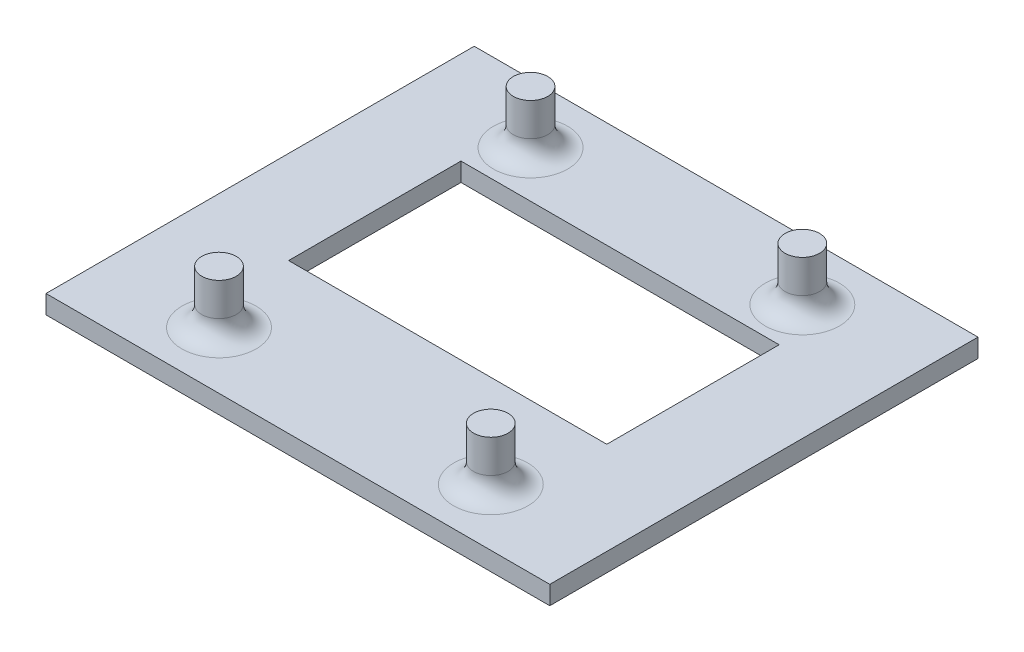
ISO-10303-21;
HEADER;
FILE_DESCRIPTION(('STEP AP214'),'2;1');
FILE_NAME('part.step','',(''),(''),'','','');
FILE_SCHEMA(('AUTOMOTIVE_DESIGN { 1 0 10303 214 1 1 1 1 }'));
ENDSEC;
DATA;
#1=APPLICATION_CONTEXT('core data for automotive mechanical design processes');
#2=APPLICATION_PROTOCOL_DEFINITION('international standard','automotive_design',2000,#1);
#3=PRODUCT_CONTEXT('',#1,'mechanical');
#4=PRODUCT('Part','Part','',(#3));
#5=PRODUCT_RELATED_PRODUCT_CATEGORY('part','',(#4));
#6=PRODUCT_DEFINITION_FORMATION('','',#4);
#7=PRODUCT_DEFINITION_CONTEXT('part definition',#1,'design');
#8=PRODUCT_DEFINITION('design','',#6,#7);
#9=PRODUCT_DEFINITION_SHAPE('','',#8);
#10=(LENGTH_UNIT() NAMED_UNIT(*) SI_UNIT(.MILLI.,.METRE.));
#11=(NAMED_UNIT(*) PLANE_ANGLE_UNIT() SI_UNIT($,.RADIAN.));
#12=(NAMED_UNIT(*) SI_UNIT($,.STERADIAN.) SOLID_ANGLE_UNIT());
#13=UNCERTAINTY_MEASURE_WITH_UNIT(LENGTH_MEASURE(1.E-05),#10,'distance_accuracy_value','');
#14=(GEOMETRIC_REPRESENTATION_CONTEXT(3) GLOBAL_UNCERTAINTY_ASSIGNED_CONTEXT((#13)) GLOBAL_UNIT_ASSIGNED_CONTEXT((#10,
#11,#12)) REPRESENTATION_CONTEXT('',''));
#15=CARTESIAN_POINT('',(0.,0.,0.));
#16=DIRECTION('',(0.,0.,1.));
#17=DIRECTION('',(1.,0.,0.));
#18=AXIS2_PLACEMENT_3D('',#15,#16,#17);
#19=CARTESIAN_POINT('',(0.,1.4,0.));
#20=DIRECTION('',(0.,1.,0.));
#21=DIRECTION('',(0.,0.,1.));
#22=AXIS2_PLACEMENT_3D('',#19,#20,#21);
#23=PLANE('',#22);
#24=CARTESIAN_POINT('',(-10.25,1.4,13.5));
#25=DIRECTION('',(0.,1.,0.));
#26=DIRECTION('',(0.,0.,1.));
#27=AXIS2_PLACEMENT_3D('',#24,#25,#26);
#28=CIRCLE('',#27,2.8);
#29=CARTESIAN_POINT('',(-10.25,1.4,16.3));
#30=VERTEX_POINT('',#29);
#31=EDGE_CURVE('E215',#30,#30,#28,.F.);
#32=ORIENTED_EDGE('',*,*,#31,.T.);
#33=EDGE_LOOP('',(#32));
#34=FACE_BOUND('',#33,.T.);
#35=CARTESIAN_POINT('',(10.25,1.4,13.5));
#36=DIRECTION('',(0.,1.,0.));
#37=DIRECTION('',(0.,0.,1.));
#38=AXIS2_PLACEMENT_3D('',#35,#36,#37);
#39=CIRCLE('',#38,2.8);
#40=CARTESIAN_POINT('',(10.25,1.4,16.3));
#41=VERTEX_POINT('',#40);
#42=EDGE_CURVE('E211',#41,#41,#39,.F.);
#43=ORIENTED_EDGE('',*,*,#42,.T.);
#44=EDGE_LOOP('',(#43));
#45=FACE_BOUND('',#44,.T.);
#46=CARTESIAN_POINT('',(10.25,1.4,-10.));
#47=DIRECTION('',(0.,1.,0.));
#48=DIRECTION('',(0.,0.,1.));
#49=AXIS2_PLACEMENT_3D('',#46,#47,#48);
#50=CIRCLE('',#49,2.8);
#51=CARTESIAN_POINT('',(10.25,1.4,-7.2));
#52=VERTEX_POINT('',#51);
#53=EDGE_CURVE('E207',#52,#52,#50,.F.);
#54=ORIENTED_EDGE('',*,*,#53,.T.);
#55=EDGE_LOOP('',(#54));
#56=FACE_BOUND('',#55,.T.);
#57=CARTESIAN_POINT('',(-10.25,1.4,-10.));
#58=DIRECTION('',(0.,1.,0.));
#59=DIRECTION('',(0.,0.,1.));
#60=AXIS2_PLACEMENT_3D('',#57,#58,#59);
#61=CIRCLE('',#60,2.8);
#62=CARTESIAN_POINT('',(-10.25,1.4,-7.2));
#63=VERTEX_POINT('',#62);
#64=EDGE_CURVE('E203',#63,#63,#61,.F.);
#65=ORIENTED_EDGE('',*,*,#64,.T.);
#66=EDGE_LOOP('',(#65));
#67=FACE_BOUND('',#66,.T.);
#68=DIRECTION('',(0.,0.,1.));
#69=VECTOR('',#68,1.);
#70=CARTESIAN_POINT('',(-19.,1.4,17.8));
#71=LINE('',#70,#69);
#72=CARTESIAN_POINT('',(-19.,1.4,-14.5));
#73=VERTEX_POINT('',#72);
#74=CARTESIAN_POINT('',(-19.,1.4,17.8));
#75=VERTEX_POINT('',#74);
#76=EDGE_CURVE('E158',#73,#75,#71,.T.);
#77=ORIENTED_EDGE('',*,*,#76,.T.);
#78=DIRECTION('',(1.,0.,0.));
#79=VECTOR('',#78,1.);
#80=CARTESIAN_POINT('',(19.,1.4,17.8));
#81=LINE('',#80,#79);
#82=CARTESIAN_POINT('',(19.,1.4,17.8));
#83=VERTEX_POINT('',#82);
#84=EDGE_CURVE('E162',#75,#83,#81,.T.);
#85=ORIENTED_EDGE('',*,*,#84,.T.);
#86=DIRECTION('',(0.,0.,-1.));
#87=VECTOR('',#86,1.);
#88=CARTESIAN_POINT('',(19.,1.4,17.8));
#89=LINE('',#88,#87);
#90=CARTESIAN_POINT('',(19.,1.4,-14.5));
#91=VERTEX_POINT('',#90);
#92=EDGE_CURVE('E166',#83,#91,#89,.T.);
#93=ORIENTED_EDGE('',*,*,#92,.T.);
#94=DIRECTION('',(-1.,0.,0.));
#95=VECTOR('',#94,1.);
#96=CARTESIAN_POINT('',(19.,1.4,-14.5));
#97=LINE('',#96,#95);
#98=EDGE_CURVE('E169',#91,#73,#97,.T.);
#99=ORIENTED_EDGE('',*,*,#98,.T.);
#100=EDGE_LOOP('',(#77,#85,#93,#99));
#101=FACE_BOUND('',#100,.T.);
#102=DIRECTION('',(1.,0.,0.));
#103=VECTOR('',#102,1.);
#104=CARTESIAN_POINT('',(12.,1.4,6.5));
#105=LINE('',#104,#103);
#106=CARTESIAN_POINT('',(-12.,1.4,6.5));
#107=VERTEX_POINT('',#106);
#108=CARTESIAN_POINT('',(12.,1.4,6.5));
#109=VERTEX_POINT('',#108);
#110=EDGE_CURVE('E117',#107,#109,#105,.T.);
#111=ORIENTED_EDGE('',*,*,#110,.F.);
#112=DIRECTION('',(0.,0.,1.));
#113=VECTOR('',#112,1.);
#114=CARTESIAN_POINT('',(-12.,1.4,6.5));
#115=LINE('',#114,#113);
#116=CARTESIAN_POINT('',(-12.,1.4,-6.5));
#117=VERTEX_POINT('',#116);
#118=EDGE_CURVE('E108',#117,#107,#115,.T.);
#119=ORIENTED_EDGE('',*,*,#118,.F.);
#120=DIRECTION('',(-1.,0.,0.));
#121=VECTOR('',#120,1.);
#122=CARTESIAN_POINT('',(12.,1.4,-6.5));
#123=LINE('',#122,#121);
#124=CARTESIAN_POINT('',(12.,1.4,-6.5));
#125=VERTEX_POINT('',#124);
#126=EDGE_CURVE('E134',#125,#117,#123,.T.);
#127=ORIENTED_EDGE('',*,*,#126,.F.);
#128=DIRECTION('',(0.,0.,-1.));
#129=VECTOR('',#128,1.);
#130=CARTESIAN_POINT('',(12.,1.4,6.5));
#131=LINE('',#130,#129);
#132=EDGE_CURVE('E130',#109,#125,#131,.T.);
#133=ORIENTED_EDGE('',*,*,#132,.F.);
#134=EDGE_LOOP('',(#111,#119,#127,#133));
#135=FACE_BOUND('',#134,.T.);
#136=ADVANCED_FACE('F42',(#34,#45,#56,#67,#101,#135),#23,.T.);
#137=CARTESIAN_POINT('',(0.,0.,0.));
#138=DIRECTION('',(0.,1.,0.));
#139=DIRECTION('',(0.,0.,1.));
#140=AXIS2_PLACEMENT_3D('',#137,#138,#139);
#141=PLANE('',#140);
#142=DIRECTION('',(0.,0.,1.));
#143=VECTOR('',#142,1.);
#144=CARTESIAN_POINT('',(-19.,0.,17.8));
#145=LINE('',#144,#143);
#146=CARTESIAN_POINT('',(-19.,0.,-14.5));
#147=VERTEX_POINT('',#146);
#148=CARTESIAN_POINT('',(-19.,0.,17.8));
#149=VERTEX_POINT('',#148);
#150=EDGE_CURVE('E126',#147,#149,#145,.T.);
#151=ORIENTED_EDGE('',*,*,#150,.F.);
#152=DIRECTION('',(-1.,0.,0.));
#153=VECTOR('',#152,1.);
#154=CARTESIAN_POINT('',(19.,0.,-14.5));
#155=LINE('',#154,#153);
#156=CARTESIAN_POINT('',(19.,0.,-14.5));
#157=VERTEX_POINT('',#156);
#158=EDGE_CURVE('E163',#157,#147,#155,.T.);
#159=ORIENTED_EDGE('',*,*,#158,.F.);
#160=DIRECTION('',(0.,0.,-1.));
#161=VECTOR('',#160,1.);
#162=CARTESIAN_POINT('',(19.,0.,17.8));
#163=LINE('',#162,#161);
#164=CARTESIAN_POINT('',(19.,0.,17.8));
#165=VERTEX_POINT('',#164);
#166=EDGE_CURVE('E179',#165,#157,#163,.T.);
#167=ORIENTED_EDGE('',*,*,#166,.F.);
#168=DIRECTION('',(1.,0.,0.));
#169=VECTOR('',#168,1.);
#170=CARTESIAN_POINT('',(19.,0.,17.8));
#171=LINE('',#170,#169);
#172=EDGE_CURVE('E176',#149,#165,#171,.T.);
#173=ORIENTED_EDGE('',*,*,#172,.F.);
#174=EDGE_LOOP('',(#151,#159,#167,#173));
#175=FACE_BOUND('',#174,.T.);
#176=DIRECTION('',(0.,0.,1.));
#177=VECTOR('',#176,1.);
#178=CARTESIAN_POINT('',(-12.,0.,6.5));
#179=LINE('',#178,#177);
#180=CARTESIAN_POINT('',(-12.,0.,-6.5));
#181=VERTEX_POINT('',#180);
#182=CARTESIAN_POINT('',(-12.,0.,6.5));
#183=VERTEX_POINT('',#182);
#184=EDGE_CURVE('E66',#181,#183,#179,.T.);
#185=ORIENTED_EDGE('',*,*,#184,.T.);
#186=DIRECTION('',(1.,0.,0.));
#187=VECTOR('',#186,1.);
#188=CARTESIAN_POINT('',(12.,0.,6.5));
#189=LINE('',#188,#187);
#190=CARTESIAN_POINT('',(12.,0.,6.5));
#191=VERTEX_POINT('',#190);
#192=EDGE_CURVE('E124',#183,#191,#189,.T.);
#193=ORIENTED_EDGE('',*,*,#192,.T.);
#194=DIRECTION('',(0.,0.,-1.));
#195=VECTOR('',#194,1.);
#196=CARTESIAN_POINT('',(12.,0.,6.5));
#197=LINE('',#196,#195);
#198=CARTESIAN_POINT('',(12.,0.,-6.5));
#199=VERTEX_POINT('',#198);
#200=EDGE_CURVE('E145',#191,#199,#197,.T.);
#201=ORIENTED_EDGE('',*,*,#200,.T.);
#202=DIRECTION('',(-1.,0.,0.));
#203=VECTOR('',#202,1.);
#204=CARTESIAN_POINT('',(12.,0.,-6.5));
#205=LINE('',#204,#203);
#206=EDGE_CURVE('E118',#199,#181,#205,.T.);
#207=ORIENTED_EDGE('',*,*,#206,.T.);
#208=EDGE_LOOP('',(#185,#193,#201,#207));
#209=FACE_BOUND('',#208,.T.);
#210=ADVANCED_FACE('F243',(#175,#209),#141,.F.);
#211=CARTESIAN_POINT('',(-19.,1.4,17.8));
#212=DIRECTION('',(1.,0.,0.));
#213=DIRECTION('',(0.,0.,-1.));
#214=AXIS2_PLACEMENT_3D('',#211,#212,#213);
#215=PLANE('',#214);
#216=ORIENTED_EDGE('',*,*,#150,.T.);
#217=DIRECTION('',(0.,-1.,0.));
#218=VECTOR('',#217,1.);
#219=CARTESIAN_POINT('',(-19.,1.4,17.8));
#220=LINE('',#219,#218);
#221=EDGE_CURVE('E195',#75,#149,#220,.T.);
#222=ORIENTED_EDGE('',*,*,#221,.F.);
#223=ORIENTED_EDGE('',*,*,#76,.F.);
#224=DIRECTION('',(0.,-1.,0.));
#225=VECTOR('',#224,1.);
#226=CARTESIAN_POINT('',(-19.,1.4,-14.5));
#227=LINE('',#226,#225);
#228=EDGE_CURVE('E172',#73,#147,#227,.T.);
#229=ORIENTED_EDGE('',*,*,#228,.T.);
#230=EDGE_LOOP('',(#216,#222,#223,#229));
#231=FACE_BOUND('',#230,.T.);
#232=ADVANCED_FACE('F249',(#231),#215,.F.);
#233=CARTESIAN_POINT('',(19.,1.4,17.8));
#234=DIRECTION('',(0.,0.,-1.));
#235=DIRECTION('',(-1.,0.,0.));
#236=AXIS2_PLACEMENT_3D('',#233,#234,#235);
#237=PLANE('',#236);
#238=ORIENTED_EDGE('',*,*,#172,.T.);
#239=DIRECTION('',(0.,-1.,0.));
#240=VECTOR('',#239,1.);
#241=CARTESIAN_POINT('',(19.,1.4,17.8));
#242=LINE('',#241,#240);
#243=EDGE_CURVE('E191',#83,#165,#242,.T.);
#244=ORIENTED_EDGE('',*,*,#243,.F.);
#245=ORIENTED_EDGE('',*,*,#84,.F.);
#246=ORIENTED_EDGE('',*,*,#221,.T.);
#247=EDGE_LOOP('',(#238,#244,#245,#246));
#248=FACE_BOUND('',#247,.T.);
#249=ADVANCED_FACE('F263',(#248),#237,.F.);
#250=CARTESIAN_POINT('',(19.,1.4,17.8));
#251=DIRECTION('',(-1.,0.,0.));
#252=DIRECTION('',(0.,0.,1.));
#253=AXIS2_PLACEMENT_3D('',#250,#251,#252);
#254=PLANE('',#253);
#255=ORIENTED_EDGE('',*,*,#166,.T.);
#256=DIRECTION('',(0.,-1.,0.));
#257=VECTOR('',#256,1.);
#258=CARTESIAN_POINT('',(19.,1.4,-14.5));
#259=LINE('',#258,#257);
#260=EDGE_CURVE('E187',#91,#157,#259,.T.);
#261=ORIENTED_EDGE('',*,*,#260,.F.);
#262=ORIENTED_EDGE('',*,*,#92,.F.);
#263=ORIENTED_EDGE('',*,*,#243,.T.);
#264=EDGE_LOOP('',(#255,#261,#262,#263));
#265=FACE_BOUND('',#264,.T.);
#266=ADVANCED_FACE('F259',(#265),#254,.F.);
#267=CARTESIAN_POINT('',(19.,1.4,-14.5));
#268=DIRECTION('',(0.,0.,1.));
#269=DIRECTION('',(1.,0.,0.));
#270=AXIS2_PLACEMENT_3D('',#267,#268,#269);
#271=PLANE('',#270);
#272=ORIENTED_EDGE('',*,*,#158,.T.);
#273=ORIENTED_EDGE('',*,*,#228,.F.);
#274=ORIENTED_EDGE('',*,*,#98,.F.);
#275=ORIENTED_EDGE('',*,*,#260,.T.);
#276=EDGE_LOOP('',(#272,#273,#274,#275));
#277=FACE_BOUND('',#276,.T.);
#278=ADVANCED_FACE('F256',(#277),#271,.F.);
#279=CARTESIAN_POINT('',(-12.,1.4,6.5));
#280=DIRECTION('',(1.,0.,0.));
#281=DIRECTION('',(0.,0.,-1.));
#282=AXIS2_PLACEMENT_3D('',#279,#280,#281);
#283=PLANE('',#282);
#284=ORIENTED_EDGE('',*,*,#184,.F.);
#285=DIRECTION('',(0.,-1.,0.));
#286=VECTOR('',#285,1.);
#287=CARTESIAN_POINT('',(-12.,1.4,-6.5));
#288=LINE('',#287,#286);
#289=EDGE_CURVE('E112',#117,#181,#288,.T.);
#290=ORIENTED_EDGE('',*,*,#289,.F.);
#291=ORIENTED_EDGE('',*,*,#118,.T.);
#292=DIRECTION('',(0.,-1.,0.));
#293=VECTOR('',#292,1.);
#294=CARTESIAN_POINT('',(-12.,1.4,6.5));
#295=LINE('',#294,#293);
#296=EDGE_CURVE('E111',#107,#183,#295,.T.);
#297=ORIENTED_EDGE('',*,*,#296,.T.);
#298=EDGE_LOOP('',(#284,#290,#291,#297));
#299=FACE_BOUND('',#298,.T.);
#300=ADVANCED_FACE('F110',(#299),#283,.T.);
#301=CARTESIAN_POINT('',(12.,1.4,6.5));
#302=DIRECTION('',(0.,0.,-1.));
#303=DIRECTION('',(-1.,0.,0.));
#304=AXIS2_PLACEMENT_3D('',#301,#302,#303);
#305=PLANE('',#304);
#306=ORIENTED_EDGE('',*,*,#192,.F.);
#307=ORIENTED_EDGE('',*,*,#296,.F.);
#308=ORIENTED_EDGE('',*,*,#110,.T.);
#309=DIRECTION('',(0.,-1.,0.));
#310=VECTOR('',#309,1.);
#311=CARTESIAN_POINT('',(12.,1.4,6.5));
#312=LINE('',#311,#310);
#313=EDGE_CURVE('E127',#109,#191,#312,.T.);
#314=ORIENTED_EDGE('',*,*,#313,.T.);
#315=EDGE_LOOP('',(#306,#307,#308,#314));
#316=FACE_BOUND('',#315,.T.);
#317=ADVANCED_FACE('F121',(#316),#305,.T.);
#318=CARTESIAN_POINT('',(12.,1.4,6.5));
#319=DIRECTION('',(-1.,0.,0.));
#320=DIRECTION('',(0.,0.,1.));
#321=AXIS2_PLACEMENT_3D('',#318,#319,#320);
#322=PLANE('',#321);
#323=ORIENTED_EDGE('',*,*,#200,.F.);
#324=ORIENTED_EDGE('',*,*,#313,.F.);
#325=ORIENTED_EDGE('',*,*,#132,.T.);
#326=DIRECTION('',(0.,-1.,0.));
#327=VECTOR('',#326,1.);
#328=CARTESIAN_POINT('',(12.,1.4,-6.5));
#329=LINE('',#328,#327);
#330=EDGE_CURVE('E58',#125,#199,#329,.T.);
#331=ORIENTED_EDGE('',*,*,#330,.T.);
#332=EDGE_LOOP('',(#323,#324,#325,#331));
#333=FACE_BOUND('',#332,.T.);
#334=ADVANCED_FACE('F331',(#333),#322,.T.);
#335=CARTESIAN_POINT('',(12.,1.4,-6.5));
#336=DIRECTION('',(0.,0.,1.));
#337=DIRECTION('',(1.,0.,0.));
#338=AXIS2_PLACEMENT_3D('',#335,#336,#337);
#339=PLANE('',#338);
#340=ORIENTED_EDGE('',*,*,#206,.F.);
#341=ORIENTED_EDGE('',*,*,#330,.F.);
#342=ORIENTED_EDGE('',*,*,#126,.T.);
#343=ORIENTED_EDGE('',*,*,#289,.T.);
#344=EDGE_LOOP('',(#340,#341,#342,#343));
#345=FACE_BOUND('',#344,.T.);
#346=ADVANCED_FACE('F327',(#345),#339,.T.);
#347=CARTESIAN_POINT('',(-10.25,5.4,-10.));
#348=DIRECTION('',(0.,-1.,0.));
#349=DIRECTION('',(0.,0.,-1.));
#350=AXIS2_PLACEMENT_3D('',#347,#348,#349);
#351=CYLINDRICAL_SURFACE('',#350,1.3);
#352=CARTESIAN_POINT('',(-10.25,2.9,-10.));
#353=DIRECTION('',(0.,1.,0.));
#354=DIRECTION('',(0.,0.,1.));
#355=AXIS2_PLACEMENT_3D('',#352,#353,#354);
#356=CIRCLE('',#355,1.3);
#357=CARTESIAN_POINT('',(-10.25,2.9,-8.7));
#358=VERTEX_POINT('',#357);
#359=EDGE_CURVE('E11',#358,#358,#356,.T.);
#360=ORIENTED_EDGE('',*,*,#359,.T.);
#361=EDGE_LOOP('',(#360));
#362=FACE_BOUND('',#361,.T.);
#363=CARTESIAN_POINT('',(-10.25,5.4,-10.));
#364=DIRECTION('',(0.,1.,0.));
#365=DIRECTION('',(0.,0.,1.));
#366=AXIS2_PLACEMENT_3D('',#363,#364,#365);
#367=CIRCLE('',#366,1.3);
#368=CARTESIAN_POINT('',(-10.25,5.4,-8.7));
#369=VERTEX_POINT('',#368);
#370=EDGE_CURVE('E142',#369,#369,#367,.T.);
#371=ORIENTED_EDGE('',*,*,#370,.F.);
#372=EDGE_LOOP('',(#371));
#373=FACE_BOUND('',#372,.T.);
#374=ADVANCED_FACE('F323',(#362,#373),#351,.T.);
#375=CARTESIAN_POINT('',(-10.25,5.4,-10.));
#376=DIRECTION('',(0.,1.,0.));
#377=DIRECTION('',(0.,0.,1.));
#378=AXIS2_PLACEMENT_3D('',#375,#376,#377);
#379=PLANE('',#378);
#380=ORIENTED_EDGE('',*,*,#370,.T.);
#381=EDGE_LOOP('',(#380));
#382=FACE_BOUND('',#381,.T.);
#383=ADVANCED_FACE('F287',(#382),#379,.T.);
#384=CARTESIAN_POINT('',(-10.25,5.4,13.5));
#385=DIRECTION('',(0.,-1.,0.));
#386=DIRECTION('',(0.,0.,-1.));
#387=AXIS2_PLACEMENT_3D('',#384,#385,#386);
#388=CYLINDRICAL_SURFACE('',#387,1.3);
#389=CARTESIAN_POINT('',(-10.25,2.9,13.5));
#390=DIRECTION('',(0.,1.,0.));
#391=DIRECTION('',(0.,0.,1.));
#392=AXIS2_PLACEMENT_3D('',#389,#390,#391);
#393=CIRCLE('',#392,1.3);
#394=CARTESIAN_POINT('',(-10.25,2.9,14.8));
#395=VERTEX_POINT('',#394);
#396=EDGE_CURVE('E199',#395,#395,#393,.T.);
#397=ORIENTED_EDGE('',*,*,#396,.T.);
#398=EDGE_LOOP('',(#397));
#399=FACE_BOUND('',#398,.T.);
#400=CARTESIAN_POINT('',(-10.25,5.4,13.5));
#401=DIRECTION('',(0.,1.,0.));
#402=DIRECTION('',(0.,0.,1.));
#403=AXIS2_PLACEMENT_3D('',#400,#401,#402);
#404=CIRCLE('',#403,1.3);
#405=CARTESIAN_POINT('',(-10.25,5.4,14.8));
#406=VERTEX_POINT('',#405);
#407=EDGE_CURVE('E291',#406,#406,#404,.T.);
#408=ORIENTED_EDGE('',*,*,#407,.F.);
#409=EDGE_LOOP('',(#408));
#410=FACE_BOUND('',#409,.T.);
#411=ADVANCED_FACE('F283',(#399,#410),#388,.T.);
#412=CARTESIAN_POINT('',(-10.25,5.4,13.5));
#413=DIRECTION('',(0.,1.,0.));
#414=DIRECTION('',(0.,0.,1.));
#415=AXIS2_PLACEMENT_3D('',#412,#413,#414);
#416=PLANE('',#415);
#417=ORIENTED_EDGE('',*,*,#407,.T.);
#418=EDGE_LOOP('',(#417));
#419=FACE_BOUND('',#418,.T.);
#420=ADVANCED_FACE('F286',(#419),#416,.T.);
#421=CARTESIAN_POINT('',(10.25,5.4,13.5));
#422=DIRECTION('',(0.,-1.,0.));
#423=DIRECTION('',(0.,0.,-1.));
#424=AXIS2_PLACEMENT_3D('',#421,#422,#423);
#425=CYLINDRICAL_SURFACE('',#424,1.3);
#426=CARTESIAN_POINT('',(10.25,2.9,13.5));
#427=DIRECTION('',(0.,1.,0.));
#428=DIRECTION('',(0.,0.,1.));
#429=AXIS2_PLACEMENT_3D('',#426,#427,#428);
#430=CIRCLE('',#429,1.3);
#431=CARTESIAN_POINT('',(10.25,2.9,14.8));
#432=VERTEX_POINT('',#431);
#433=EDGE_CURVE('E219',#432,#432,#430,.T.);
#434=ORIENTED_EDGE('',*,*,#433,.T.);
#435=EDGE_LOOP('',(#434));
#436=FACE_BOUND('',#435,.T.);
#437=CARTESIAN_POINT('',(10.25,5.4,13.5));
#438=DIRECTION('',(0.,1.,0.));
#439=DIRECTION('',(0.,0.,-1.));
#440=AXIS2_PLACEMENT_3D('',#437,#438,#439);
#441=CIRCLE('',#440,1.3);
#442=CARTESIAN_POINT('',(10.25,5.4,12.2));
#443=VERTEX_POINT('',#442);
#444=EDGE_CURVE('E294',#443,#443,#441,.T.);
#445=ORIENTED_EDGE('',*,*,#444,.F.);
#446=EDGE_LOOP('',(#445));
#447=FACE_BOUND('',#446,.T.);
#448=ADVANCED_FACE('F312',(#436,#447),#425,.T.);
#449=CARTESIAN_POINT('',(10.25,5.4,13.5));
#450=DIRECTION('',(0.,-1.,0.));
#451=DIRECTION('',(0.,0.,-1.));
#452=AXIS2_PLACEMENT_3D('',#449,#450,#451);
#453=PLANE('',#452);
#454=ORIENTED_EDGE('',*,*,#444,.T.);
#455=EDGE_LOOP('',(#454));
#456=FACE_BOUND('',#455,.T.);
#457=ADVANCED_FACE('F307',(#456),#453,.F.);
#458=CARTESIAN_POINT('',(10.25,5.4,-10.));
#459=DIRECTION('',(0.,-1.,0.));
#460=DIRECTION('',(0.,0.,-1.));
#461=AXIS2_PLACEMENT_3D('',#458,#459,#460);
#462=CYLINDRICAL_SURFACE('',#461,1.3);
#463=CARTESIAN_POINT('',(10.25,2.9,-10.));
#464=DIRECTION('',(0.,1.,0.));
#465=DIRECTION('',(0.,0.,1.));
#466=AXIS2_PLACEMENT_3D('',#463,#464,#465);
#467=CIRCLE('',#466,1.3);
#468=CARTESIAN_POINT('',(10.25,2.9,-8.7));
#469=VERTEX_POINT('',#468);
#470=EDGE_CURVE('E51',#469,#469,#467,.T.);
#471=ORIENTED_EDGE('',*,*,#470,.T.);
#472=EDGE_LOOP('',(#471));
#473=FACE_BOUND('',#472,.T.);
#474=CARTESIAN_POINT('',(10.25,5.4,-10.));
#475=DIRECTION('',(0.,1.,0.));
#476=DIRECTION('',(0.,0.,-1.));
#477=AXIS2_PLACEMENT_3D('',#474,#475,#476);
#478=CIRCLE('',#477,1.3);
#479=CARTESIAN_POINT('',(10.25,5.4,-11.3));
#480=VERTEX_POINT('',#479);
#481=EDGE_CURVE('E300',#480,#480,#478,.T.);
#482=ORIENTED_EDGE('',*,*,#481,.F.);
#483=EDGE_LOOP('',(#482));
#484=FACE_BOUND('',#483,.T.);
#485=ADVANCED_FACE('F226',(#473,#484),#462,.T.);
#486=CARTESIAN_POINT('',(10.25,5.4,-10.));
#487=DIRECTION('',(0.,-1.,0.));
#488=DIRECTION('',(0.,0.,-1.));
#489=AXIS2_PLACEMENT_3D('',#486,#487,#488);
#490=PLANE('',#489);
#491=ORIENTED_EDGE('',*,*,#481,.T.);
#492=EDGE_LOOP('',(#491));
#493=FACE_BOUND('',#492,.T.);
#494=ADVANCED_FACE('F272',(#493),#490,.F.);
#495=CARTESIAN_POINT('',(-10.25,2.9,13.5));
#496=DIRECTION('',(0.,1.,0.));
#497=DIRECTION('',(0.,0.,1.));
#498=AXIS2_PLACEMENT_3D('',#495,#496,#497);
#499=TOROIDAL_SURFACE('',#498,2.8,1.5);
#500=ORIENTED_EDGE('',*,*,#31,.F.);
#501=EDGE_LOOP('',(#500));
#502=FACE_BOUND('',#501,.T.);
#503=ORIENTED_EDGE('',*,*,#396,.F.);
#504=EDGE_LOOP('',(#503));
#505=FACE_BOUND('',#504,.T.);
#506=ADVANCED_FACE('F238',(#502,#505),#499,.F.);
#507=CARTESIAN_POINT('',(10.25,2.9,13.5));
#508=DIRECTION('',(0.,1.,0.));
#509=DIRECTION('',(0.,0.,1.));
#510=AXIS2_PLACEMENT_3D('',#507,#508,#509);
#511=TOROIDAL_SURFACE('',#510,2.8,1.5);
#512=ORIENTED_EDGE('',*,*,#42,.F.);
#513=EDGE_LOOP('',(#512));
#514=FACE_BOUND('',#513,.T.);
#515=ORIENTED_EDGE('',*,*,#433,.F.);
#516=EDGE_LOOP('',(#515));
#517=FACE_BOUND('',#516,.T.);
#518=ADVANCED_FACE('F231',(#514,#517),#511,.F.);
#519=CARTESIAN_POINT('',(10.25,2.9,-10.));
#520=DIRECTION('',(0.,1.,0.));
#521=DIRECTION('',(0.,0.,1.));
#522=AXIS2_PLACEMENT_3D('',#519,#520,#521);
#523=TOROIDAL_SURFACE('',#522,2.8,1.5);
#524=ORIENTED_EDGE('',*,*,#53,.F.);
#525=EDGE_LOOP('',(#524));
#526=FACE_BOUND('',#525,.T.);
#527=ORIENTED_EDGE('',*,*,#470,.F.);
#528=EDGE_LOOP('',(#527));
#529=FACE_BOUND('',#528,.T.);
#530=ADVANCED_FACE('F229',(#526,#529),#523,.F.);
#531=CARTESIAN_POINT('',(-10.25,2.9,-10.));
#532=DIRECTION('',(0.,1.,0.));
#533=DIRECTION('',(0.,0.,1.));
#534=AXIS2_PLACEMENT_3D('',#531,#532,#533);
#535=TOROIDAL_SURFACE('',#534,2.8,1.5);
#536=ORIENTED_EDGE('',*,*,#64,.F.);
#537=EDGE_LOOP('',(#536));
#538=FACE_BOUND('',#537,.T.);
#539=ORIENTED_EDGE('',*,*,#359,.F.);
#540=EDGE_LOOP('',(#539));
#541=FACE_BOUND('',#540,.T.);
#542=ADVANCED_FACE('F44',(#538,#541),#535,.F.);
#543=CLOSED_SHELL('',(#136,#210,#232,#249,#266,#278,#300,#317,#334,#346,#374,#383,#411,#420,
#448,#457,#485,#494,#506,#518,#530,#542));
#544=MANIFOLD_SOLID_BREP('B2',#543);
#545=ADVANCED_BREP_SHAPE_REPRESENTATION('',(#18,#544),#14);
#546=SHAPE_DEFINITION_REPRESENTATION(#9,#545);
ENDSEC;
END-ISO-10303-21;
